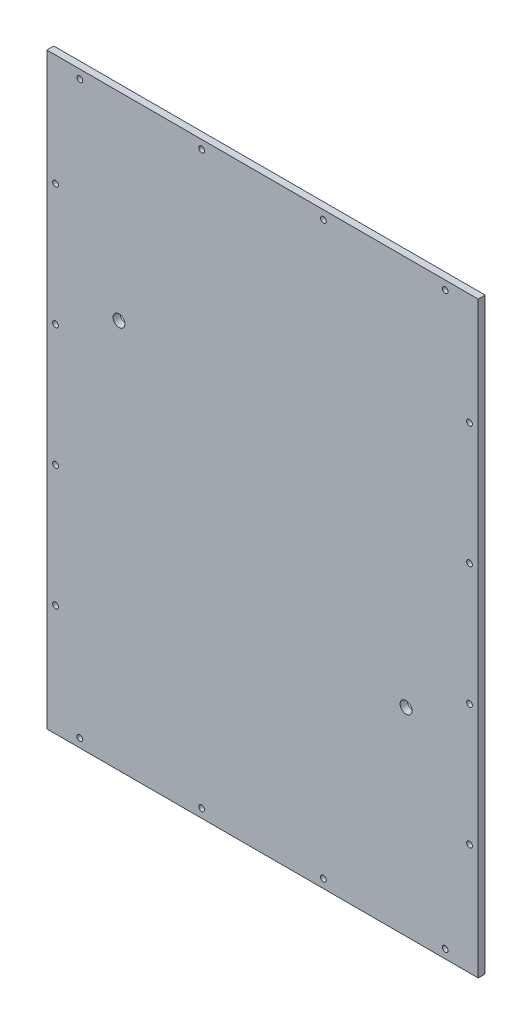
ISO-10303-21;
HEADER;
FILE_DESCRIPTION(('STEP AP214'),'2;1');
FILE_NAME('part.step','',(''),(''),'','','');
FILE_SCHEMA(('AUTOMOTIVE_DESIGN { 1 0 10303 214 1 1 1 1 }'));
ENDSEC;
DATA;
#1=APPLICATION_CONTEXT('core data for automotive mechanical design processes');
#2=APPLICATION_PROTOCOL_DEFINITION('international standard','automotive_design',2000,#1);
#3=PRODUCT_CONTEXT('',#1,'mechanical');
#4=PRODUCT('Part','Part','',(#3));
#5=PRODUCT_RELATED_PRODUCT_CATEGORY('part','',(#4));
#6=PRODUCT_DEFINITION_FORMATION('','',#4);
#7=PRODUCT_DEFINITION_CONTEXT('part definition',#1,'design');
#8=PRODUCT_DEFINITION('design','',#6,#7);
#9=PRODUCT_DEFINITION_SHAPE('','',#8);
#10=(LENGTH_UNIT() NAMED_UNIT(*) SI_UNIT(.MILLI.,.METRE.));
#11=(NAMED_UNIT(*) PLANE_ANGLE_UNIT() SI_UNIT($,.RADIAN.));
#12=(NAMED_UNIT(*) SI_UNIT($,.STERADIAN.) SOLID_ANGLE_UNIT());
#13=UNCERTAINTY_MEASURE_WITH_UNIT(LENGTH_MEASURE(1.E-05),#10,'distance_accuracy_value','');
#14=(GEOMETRIC_REPRESENTATION_CONTEXT(3) GLOBAL_UNCERTAINTY_ASSIGNED_CONTEXT((#13)) GLOBAL_UNIT_ASSIGNED_CONTEXT((#10,
#11,#12)) REPRESENTATION_CONTEXT('',''));
#15=CARTESIAN_POINT('',(0.,0.,0.));
#16=DIRECTION('',(0.,0.,1.));
#17=DIRECTION('',(1.,0.,0.));
#18=AXIS2_PLACEMENT_3D('',#15,#16,#17);
#19=CARTESIAN_POINT('',(124.,169.,4.));
#20=DIRECTION('',(1.,0.,0.));
#21=DIRECTION('',(0.,0.,-1.));
#22=AXIS2_PLACEMENT_3D('',#19,#20,#21);
#23=PLANE('',#22);
#24=DIRECTION('',(0.,-1.,0.));
#25=VECTOR('',#24,1.);
#26=CARTESIAN_POINT('',(124.,169.,0.));
#27=LINE('',#26,#25);
#28=CARTESIAN_POINT('',(124.,169.,0.));
#29=VERTEX_POINT('',#28);
#30=CARTESIAN_POINT('',(124.,-169.,0.));
#31=VERTEX_POINT('',#30);
#32=EDGE_CURVE('E112',#29,#31,#27,.T.);
#33=ORIENTED_EDGE('',*,*,#32,.F.);
#34=DIRECTION('',(0.,0.,-1.));
#35=VECTOR('',#34,1.);
#36=CARTESIAN_POINT('',(124.,169.,4.));
#37=LINE('',#36,#35);
#38=CARTESIAN_POINT('',(124.,169.,4.));
#39=VERTEX_POINT('',#38);
#40=EDGE_CURVE('E11',#39,#29,#37,.T.);
#41=ORIENTED_EDGE('',*,*,#40,.F.);
#42=DIRECTION('',(0.,-1.,0.));
#43=VECTOR('',#42,1.);
#44=CARTESIAN_POINT('',(124.,169.,4.));
#45=LINE('',#44,#43);
#46=CARTESIAN_POINT('',(124.,-169.,4.));
#47=VERTEX_POINT('',#46);
#48=EDGE_CURVE('E87',#39,#47,#45,.T.);
#49=ORIENTED_EDGE('',*,*,#48,.T.);
#50=DIRECTION('',(0.,0.,-1.));
#51=VECTOR('',#50,1.);
#52=CARTESIAN_POINT('',(124.,-169.,4.));
#53=LINE('',#52,#51);
#54=EDGE_CURVE('E92',#47,#31,#53,.T.);
#55=ORIENTED_EDGE('',*,*,#54,.T.);
#56=EDGE_LOOP('',(#33,#41,#49,#55));
#57=FACE_BOUND('',#56,.T.);
#58=ADVANCED_FACE('F42',(#57),#23,.T.);
#59=CARTESIAN_POINT('',(124.,169.,4.));
#60=DIRECTION('',(0.,1.,0.));
#61=DIRECTION('',(-1.,0.,0.));
#62=AXIS2_PLACEMENT_3D('',#59,#60,#61);
#63=PLANE('',#62);
#64=DIRECTION('',(1.,0.,0.));
#65=VECTOR('',#64,1.);
#66=CARTESIAN_POINT('',(124.,169.,0.));
#67=LINE('',#66,#65);
#68=CARTESIAN_POINT('',(-124.,169.,0.));
#69=VERTEX_POINT('',#68);
#70=EDGE_CURVE('E102',#69,#29,#67,.T.);
#71=ORIENTED_EDGE('',*,*,#70,.F.);
#72=DIRECTION('',(0.,0.,-1.));
#73=VECTOR('',#72,1.);
#74=CARTESIAN_POINT('',(-124.,169.,4.));
#75=LINE('',#74,#73);
#76=CARTESIAN_POINT('',(-124.,169.,4.));
#77=VERTEX_POINT('',#76);
#78=EDGE_CURVE('E51',#77,#69,#75,.T.);
#79=ORIENTED_EDGE('',*,*,#78,.F.);
#80=DIRECTION('',(1.,0.,0.));
#81=VECTOR('',#80,1.);
#82=CARTESIAN_POINT('',(124.,169.,4.));
#83=LINE('',#82,#81);
#84=EDGE_CURVE('E100',#77,#39,#83,.T.);
#85=ORIENTED_EDGE('',*,*,#84,.T.);
#86=ORIENTED_EDGE('',*,*,#40,.T.);
#87=EDGE_LOOP('',(#71,#79,#85,#86));
#88=FACE_BOUND('',#87,.T.);
#89=ADVANCED_FACE('F121',(#88),#63,.T.);
#90=CARTESIAN_POINT('',(-124.,169.,4.));
#91=DIRECTION('',(-1.,0.,0.));
#92=DIRECTION('',(0.,-1.,0.));
#93=AXIS2_PLACEMENT_3D('',#90,#91,#92);
#94=PLANE('',#93);
#95=DIRECTION('',(0.,1.,0.));
#96=VECTOR('',#95,1.);
#97=CARTESIAN_POINT('',(-124.,169.,0.));
#98=LINE('',#97,#96);
#99=CARTESIAN_POINT('',(-124.,-169.,0.));
#100=VERTEX_POINT('',#99);
#101=EDGE_CURVE('E59',#100,#69,#98,.T.);
#102=ORIENTED_EDGE('',*,*,#101,.F.);
#103=DIRECTION('',(0.,0.,-1.));
#104=VECTOR('',#103,1.);
#105=CARTESIAN_POINT('',(-124.,-169.,4.));
#106=LINE('',#105,#104);
#107=CARTESIAN_POINT('',(-124.,-169.,4.));
#108=VERTEX_POINT('',#107);
#109=EDGE_CURVE('E99',#108,#100,#106,.T.);
#110=ORIENTED_EDGE('',*,*,#109,.F.);
#111=DIRECTION('',(0.,1.,0.));
#112=VECTOR('',#111,1.);
#113=CARTESIAN_POINT('',(-124.,169.,4.));
#114=LINE('',#113,#112);
#115=EDGE_CURVE('E67',#108,#77,#114,.T.);
#116=ORIENTED_EDGE('',*,*,#115,.T.);
#117=ORIENTED_EDGE('',*,*,#78,.T.);
#118=EDGE_LOOP('',(#102,#110,#116,#117));
#119=FACE_BOUND('',#118,.T.);
#120=ADVANCED_FACE('F122',(#119),#94,.T.);
#121=CARTESIAN_POINT('',(124.,-169.,4.));
#122=DIRECTION('',(0.,-1.,0.));
#123=DIRECTION('',(1.,0.,0.));
#124=AXIS2_PLACEMENT_3D('',#121,#122,#123);
#125=PLANE('',#124);
#126=DIRECTION('',(-1.,0.,0.));
#127=VECTOR('',#126,1.);
#128=CARTESIAN_POINT('',(124.,-169.,0.));
#129=LINE('',#128,#127);
#130=EDGE_CURVE('E95',#31,#100,#129,.T.);
#131=ORIENTED_EDGE('',*,*,#130,.F.);
#132=ORIENTED_EDGE('',*,*,#54,.F.);
#133=DIRECTION('',(-1.,0.,0.));
#134=VECTOR('',#133,1.);
#135=CARTESIAN_POINT('',(124.,-169.,4.));
#136=LINE('',#135,#134);
#137=EDGE_CURVE('E82',#47,#108,#136,.T.);
#138=ORIENTED_EDGE('',*,*,#137,.T.);
#139=ORIENTED_EDGE('',*,*,#109,.T.);
#140=EDGE_LOOP('',(#131,#132,#138,#139));
#141=FACE_BOUND('',#140,.T.);
#142=ADVANCED_FACE('F93',(#141),#125,.T.);
#143=CARTESIAN_POINT('',(0.,0.,0.));
#144=DIRECTION('',(0.,0.,-1.));
#145=DIRECTION('',(-1.,0.,0.));
#146=AXIS2_PLACEMENT_3D('',#143,#144,#145);
#147=PLANE('',#146);
#148=CARTESIAN_POINT('',(-82.5,55.,0.));
#149=DIRECTION('',(0.,0.,-1.));
#150=DIRECTION('',(-1.,0.,0.));
#151=AXIS2_PLACEMENT_3D('',#148,#149,#150);
#152=CIRCLE('',#151,3.39999999999999);
#153=CARTESIAN_POINT('',(-85.9,55.,0.));
#154=VERTEX_POINT('',#153);
#155=EDGE_CURVE('E359',#154,#154,#152,.T.);
#156=ORIENTED_EDGE('',*,*,#155,.F.);
#157=EDGE_LOOP('',(#156));
#158=FACE_BOUND('',#157,.T.);
#159=CARTESIAN_POINT('',(82.5,-55.,0.));
#160=DIRECTION('',(0.,0.,-1.));
#161=DIRECTION('',(-1.,0.,0.));
#162=AXIS2_PLACEMENT_3D('',#159,#160,#161);
#163=CIRCLE('',#162,3.39999999999999);
#164=CARTESIAN_POINT('',(79.1,-55.,0.));
#165=VERTEX_POINT('',#164);
#166=EDGE_CURVE('E361',#165,#165,#163,.T.);
#167=ORIENTED_EDGE('',*,*,#166,.F.);
#168=EDGE_LOOP('',(#167));
#169=FACE_BOUND('',#168,.T.);
#170=CARTESIAN_POINT('',(-105.,-164.,0.));
#171=DIRECTION('',(0.,0.,-1.));
#172=DIRECTION('',(-1.,0.,0.));
#173=AXIS2_PLACEMENT_3D('',#170,#171,#172);
#174=CIRCLE('',#173,1.65);
#175=CARTESIAN_POINT('',(-106.65,-164.,0.));
#176=VERTEX_POINT('',#175);
#177=EDGE_CURVE('E414',#176,#176,#174,.T.);
#178=ORIENTED_EDGE('',*,*,#177,.F.);
#179=EDGE_LOOP('',(#178));
#180=FACE_BOUND('',#179,.T.);
#181=CARTESIAN_POINT('',(-35.,-164.,0.));
#182=DIRECTION('',(0.,0.,-1.));
#183=DIRECTION('',(-1.,0.,0.));
#184=AXIS2_PLACEMENT_3D('',#181,#182,#183);
#185=CIRCLE('',#184,1.65);
#186=CARTESIAN_POINT('',(-36.65,-164.,0.));
#187=VERTEX_POINT('',#186);
#188=EDGE_CURVE('E417',#187,#187,#185,.T.);
#189=ORIENTED_EDGE('',*,*,#188,.F.);
#190=EDGE_LOOP('',(#189));
#191=FACE_BOUND('',#190,.T.);
#192=CARTESIAN_POINT('',(-119.,-105.,0.));
#193=DIRECTION('',(0.,0.,-1.));
#194=DIRECTION('',(-1.,0.,0.));
#195=AXIS2_PLACEMENT_3D('',#192,#193,#194);
#196=CIRCLE('',#195,1.65);
#197=CARTESIAN_POINT('',(-120.65,-105.,0.));
#198=VERTEX_POINT('',#197);
#199=EDGE_CURVE('E420',#198,#198,#196,.T.);
#200=ORIENTED_EDGE('',*,*,#199,.F.);
#201=EDGE_LOOP('',(#200));
#202=FACE_BOUND('',#201,.T.);
#203=CARTESIAN_POINT('',(-119.,-35.,0.));
#204=DIRECTION('',(0.,0.,-1.));
#205=DIRECTION('',(-1.,0.,0.));
#206=AXIS2_PLACEMENT_3D('',#203,#204,#205);
#207=CIRCLE('',#206,1.65);
#208=CARTESIAN_POINT('',(-120.65,-35.,0.));
#209=VERTEX_POINT('',#208);
#210=EDGE_CURVE('E423',#209,#209,#207,.T.);
#211=ORIENTED_EDGE('',*,*,#210,.F.);
#212=EDGE_LOOP('',(#211));
#213=FACE_BOUND('',#212,.T.);
#214=CARTESIAN_POINT('',(-105.,164.,0.));
#215=DIRECTION('',(0.,0.,-1.));
#216=DIRECTION('',(-1.,0.,0.));
#217=AXIS2_PLACEMENT_3D('',#214,#215,#216);
#218=CIRCLE('',#217,1.65);
#219=CARTESIAN_POINT('',(-106.65,164.,0.));
#220=VERTEX_POINT('',#219);
#221=EDGE_CURVE('E426',#220,#220,#218,.T.);
#222=ORIENTED_EDGE('',*,*,#221,.F.);
#223=EDGE_LOOP('',(#222));
#224=FACE_BOUND('',#223,.T.);
#225=CARTESIAN_POINT('',(-35.,164.,0.));
#226=DIRECTION('',(0.,0.,-1.));
#227=DIRECTION('',(-1.,0.,0.));
#228=AXIS2_PLACEMENT_3D('',#225,#226,#227);
#229=CIRCLE('',#228,1.65);
#230=CARTESIAN_POINT('',(-36.65,164.,0.));
#231=VERTEX_POINT('',#230);
#232=EDGE_CURVE('E429',#231,#231,#229,.T.);
#233=ORIENTED_EDGE('',*,*,#232,.F.);
#234=EDGE_LOOP('',(#233));
#235=FACE_BOUND('',#234,.T.);
#236=CARTESIAN_POINT('',(-119.,105.,0.));
#237=DIRECTION('',(0.,0.,-1.));
#238=DIRECTION('',(-1.,0.,0.));
#239=AXIS2_PLACEMENT_3D('',#236,#237,#238);
#240=CIRCLE('',#239,1.65);
#241=CARTESIAN_POINT('',(-120.65,105.,0.));
#242=VERTEX_POINT('',#241);
#243=EDGE_CURVE('E432',#242,#242,#240,.T.);
#244=ORIENTED_EDGE('',*,*,#243,.F.);
#245=EDGE_LOOP('',(#244));
#246=FACE_BOUND('',#245,.T.);
#247=CARTESIAN_POINT('',(-119.,35.,0.));
#248=DIRECTION('',(0.,0.,-1.));
#249=DIRECTION('',(-1.,0.,0.));
#250=AXIS2_PLACEMENT_3D('',#247,#248,#249);
#251=CIRCLE('',#250,1.65);
#252=CARTESIAN_POINT('',(-120.65,35.,0.));
#253=VERTEX_POINT('',#252);
#254=EDGE_CURVE('E435',#253,#253,#251,.T.);
#255=ORIENTED_EDGE('',*,*,#254,.F.);
#256=EDGE_LOOP('',(#255));
#257=FACE_BOUND('',#256,.T.);
#258=CARTESIAN_POINT('',(105.,-164.,0.));
#259=DIRECTION('',(0.,0.,-1.));
#260=DIRECTION('',(-1.,0.,0.));
#261=AXIS2_PLACEMENT_3D('',#258,#259,#260);
#262=CIRCLE('',#261,1.65);
#263=CARTESIAN_POINT('',(103.35,-164.,0.));
#264=VERTEX_POINT('',#263);
#265=EDGE_CURVE('E438',#264,#264,#262,.T.);
#266=ORIENTED_EDGE('',*,*,#265,.F.);
#267=EDGE_LOOP('',(#266));
#268=FACE_BOUND('',#267,.T.);
#269=CARTESIAN_POINT('',(35.,-164.,0.));
#270=DIRECTION('',(0.,0.,-1.));
#271=DIRECTION('',(-1.,0.,0.));
#272=AXIS2_PLACEMENT_3D('',#269,#270,#271);
#273=CIRCLE('',#272,1.65);
#274=CARTESIAN_POINT('',(33.35,-164.,0.));
#275=VERTEX_POINT('',#274);
#276=EDGE_CURVE('E441',#275,#275,#273,.T.);
#277=ORIENTED_EDGE('',*,*,#276,.F.);
#278=EDGE_LOOP('',(#277));
#279=FACE_BOUND('',#278,.T.);
#280=CARTESIAN_POINT('',(119.,-105.,0.));
#281=DIRECTION('',(0.,0.,-1.));
#282=DIRECTION('',(-1.,0.,0.));
#283=AXIS2_PLACEMENT_3D('',#280,#281,#282);
#284=CIRCLE('',#283,1.65);
#285=CARTESIAN_POINT('',(117.35,-105.,0.));
#286=VERTEX_POINT('',#285);
#287=EDGE_CURVE('E444',#286,#286,#284,.T.);
#288=ORIENTED_EDGE('',*,*,#287,.F.);
#289=EDGE_LOOP('',(#288));
#290=FACE_BOUND('',#289,.T.);
#291=CARTESIAN_POINT('',(119.,-35.,0.));
#292=DIRECTION('',(0.,0.,-1.));
#293=DIRECTION('',(-1.,0.,0.));
#294=AXIS2_PLACEMENT_3D('',#291,#292,#293);
#295=CIRCLE('',#294,1.65);
#296=CARTESIAN_POINT('',(117.35,-35.,0.));
#297=VERTEX_POINT('',#296);
#298=EDGE_CURVE('E447',#297,#297,#295,.T.);
#299=ORIENTED_EDGE('',*,*,#298,.F.);
#300=EDGE_LOOP('',(#299));
#301=FACE_BOUND('',#300,.T.);
#302=CARTESIAN_POINT('',(105.,164.,0.));
#303=DIRECTION('',(0.,0.,-1.));
#304=DIRECTION('',(-1.,0.,0.));
#305=AXIS2_PLACEMENT_3D('',#302,#303,#304);
#306=CIRCLE('',#305,1.65);
#307=CARTESIAN_POINT('',(103.35,164.,0.));
#308=VERTEX_POINT('',#307);
#309=EDGE_CURVE('E450',#308,#308,#306,.T.);
#310=ORIENTED_EDGE('',*,*,#309,.F.);
#311=EDGE_LOOP('',(#310));
#312=FACE_BOUND('',#311,.T.);
#313=CARTESIAN_POINT('',(35.,164.,0.));
#314=DIRECTION('',(0.,0.,-1.));
#315=DIRECTION('',(-1.,0.,0.));
#316=AXIS2_PLACEMENT_3D('',#313,#314,#315);
#317=CIRCLE('',#316,1.65);
#318=CARTESIAN_POINT('',(33.35,164.,0.));
#319=VERTEX_POINT('',#318);
#320=EDGE_CURVE('E453',#319,#319,#317,.T.);
#321=ORIENTED_EDGE('',*,*,#320,.F.);
#322=EDGE_LOOP('',(#321));
#323=FACE_BOUND('',#322,.T.);
#324=CARTESIAN_POINT('',(119.,105.,0.));
#325=DIRECTION('',(0.,0.,-1.));
#326=DIRECTION('',(-1.,0.,0.));
#327=AXIS2_PLACEMENT_3D('',#324,#325,#326);
#328=CIRCLE('',#327,1.65);
#329=CARTESIAN_POINT('',(117.35,105.,0.));
#330=VERTEX_POINT('',#329);
#331=EDGE_CURVE('E455',#330,#330,#328,.T.);
#332=ORIENTED_EDGE('',*,*,#331,.F.);
#333=EDGE_LOOP('',(#332));
#334=FACE_BOUND('',#333,.T.);
#335=CARTESIAN_POINT('',(119.,35.,0.));
#336=DIRECTION('',(0.,0.,-1.));
#337=DIRECTION('',(-1.,0.,0.));
#338=AXIS2_PLACEMENT_3D('',#335,#336,#337);
#339=CIRCLE('',#338,1.65);
#340=CARTESIAN_POINT('',(117.35,35.,0.));
#341=VERTEX_POINT('',#340);
#342=EDGE_CURVE('E107',#341,#341,#339,.T.);
#343=ORIENTED_EDGE('',*,*,#342,.F.);
#344=EDGE_LOOP('',(#343));
#345=FACE_BOUND('',#344,.T.);
#346=ORIENTED_EDGE('',*,*,#70,.T.);
#347=ORIENTED_EDGE('',*,*,#32,.T.);
#348=ORIENTED_EDGE('',*,*,#130,.T.);
#349=ORIENTED_EDGE('',*,*,#101,.T.);
#350=EDGE_LOOP('',(#346,#347,#348,#349));
#351=FACE_BOUND('',#350,.T.);
#352=ADVANCED_FACE('F44',(#158,#169,#180,#191,#202,#213,#224,#235,#246,#257,#268,#279,#290,#301,
#312,#323,#334,#345,#351),#147,.T.);
#353=CARTESIAN_POINT('',(119.,35.,0.));
#354=DIRECTION('',(0.,0.,-1.));
#355=DIRECTION('',(-1.,0.,0.));
#356=AXIS2_PLACEMENT_3D('',#353,#354,#355);
#357=CYLINDRICAL_SURFACE('',#356,1.65);
#358=CARTESIAN_POINT('',(119.,35.,4.));
#359=DIRECTION('',(0.,0.,-1.));
#360=DIRECTION('',(-1.,0.,0.));
#361=AXIS2_PLACEMENT_3D('',#358,#359,#360);
#362=CIRCLE('',#361,1.65);
#363=CARTESIAN_POINT('',(117.35,35.,4.));
#364=VERTEX_POINT('',#363);
#365=EDGE_CURVE('E411',#364,#364,#362,.F.);
#366=ORIENTED_EDGE('',*,*,#365,.T.);
#367=EDGE_LOOP('',(#366));
#368=FACE_BOUND('',#367,.T.);
#369=ORIENTED_EDGE('',*,*,#342,.T.);
#370=EDGE_LOOP('',(#369));
#371=FACE_BOUND('',#370,.T.);
#372=ADVANCED_FACE('F155',(#368,#371),#357,.F.);
#373=CARTESIAN_POINT('',(119.,105.,0.));
#374=DIRECTION('',(0.,0.,-1.));
#375=DIRECTION('',(-1.,0.,0.));
#376=AXIS2_PLACEMENT_3D('',#373,#374,#375);
#377=CYLINDRICAL_SURFACE('',#376,1.65);
#378=CARTESIAN_POINT('',(119.,105.,4.));
#379=DIRECTION('',(0.,0.,-1.));
#380=DIRECTION('',(-1.,0.,0.));
#381=AXIS2_PLACEMENT_3D('',#378,#379,#380);
#382=CIRCLE('',#381,1.65);
#383=CARTESIAN_POINT('',(117.35,105.,4.));
#384=VERTEX_POINT('',#383);
#385=EDGE_CURVE('E408',#384,#384,#382,.F.);
#386=ORIENTED_EDGE('',*,*,#385,.T.);
#387=EDGE_LOOP('',(#386));
#388=FACE_BOUND('',#387,.T.);
#389=ORIENTED_EDGE('',*,*,#331,.T.);
#390=EDGE_LOOP('',(#389));
#391=FACE_BOUND('',#390,.T.);
#392=ADVANCED_FACE('F160',(#388,#391),#377,.F.);
#393=CARTESIAN_POINT('',(35.,164.,0.));
#394=DIRECTION('',(0.,0.,-1.));
#395=DIRECTION('',(-1.,0.,0.));
#396=AXIS2_PLACEMENT_3D('',#393,#394,#395);
#397=CYLINDRICAL_SURFACE('',#396,1.65);
#398=CARTESIAN_POINT('',(35.,164.,4.));
#399=DIRECTION('',(0.,0.,-1.));
#400=DIRECTION('',(-1.,0.,0.));
#401=AXIS2_PLACEMENT_3D('',#398,#399,#400);
#402=CIRCLE('',#401,1.65);
#403=CARTESIAN_POINT('',(33.35,164.,4.));
#404=VERTEX_POINT('',#403);
#405=EDGE_CURVE('E405',#404,#404,#402,.F.);
#406=ORIENTED_EDGE('',*,*,#405,.T.);
#407=EDGE_LOOP('',(#406));
#408=FACE_BOUND('',#407,.T.);
#409=ORIENTED_EDGE('',*,*,#320,.T.);
#410=EDGE_LOOP('',(#409));
#411=FACE_BOUND('',#410,.T.);
#412=ADVANCED_FACE('F170',(#408,#411),#397,.F.);
#413=CARTESIAN_POINT('',(105.,164.,0.));
#414=DIRECTION('',(0.,0.,-1.));
#415=DIRECTION('',(-1.,0.,0.));
#416=AXIS2_PLACEMENT_3D('',#413,#414,#415);
#417=CYLINDRICAL_SURFACE('',#416,1.65);
#418=CARTESIAN_POINT('',(105.,164.,4.));
#419=DIRECTION('',(0.,0.,-1.));
#420=DIRECTION('',(-1.,0.,0.));
#421=AXIS2_PLACEMENT_3D('',#418,#419,#420);
#422=CIRCLE('',#421,1.65);
#423=CARTESIAN_POINT('',(103.35,164.,4.));
#424=VERTEX_POINT('',#423);
#425=EDGE_CURVE('E402',#424,#424,#422,.F.);
#426=ORIENTED_EDGE('',*,*,#425,.T.);
#427=EDGE_LOOP('',(#426));
#428=FACE_BOUND('',#427,.T.);
#429=ORIENTED_EDGE('',*,*,#309,.T.);
#430=EDGE_LOOP('',(#429));
#431=FACE_BOUND('',#430,.T.);
#432=ADVANCED_FACE('F180',(#428,#431),#417,.F.);
#433=CARTESIAN_POINT('',(119.,-35.,0.));
#434=DIRECTION('',(0.,0.,-1.));
#435=DIRECTION('',(-1.,0.,0.));
#436=AXIS2_PLACEMENT_3D('',#433,#434,#435);
#437=CYLINDRICAL_SURFACE('',#436,1.65);
#438=CARTESIAN_POINT('',(119.,-35.,4.));
#439=DIRECTION('',(0.,0.,-1.));
#440=DIRECTION('',(-1.,0.,0.));
#441=AXIS2_PLACEMENT_3D('',#438,#439,#440);
#442=CIRCLE('',#441,1.65);
#443=CARTESIAN_POINT('',(117.35,-35.,4.));
#444=VERTEX_POINT('',#443);
#445=EDGE_CURVE('E399',#444,#444,#442,.F.);
#446=ORIENTED_EDGE('',*,*,#445,.T.);
#447=EDGE_LOOP('',(#446));
#448=FACE_BOUND('',#447,.T.);
#449=ORIENTED_EDGE('',*,*,#298,.T.);
#450=EDGE_LOOP('',(#449));
#451=FACE_BOUND('',#450,.T.);
#452=ADVANCED_FACE('F190',(#448,#451),#437,.F.);
#453=CARTESIAN_POINT('',(119.,-105.,0.));
#454=DIRECTION('',(0.,0.,-1.));
#455=DIRECTION('',(-1.,0.,0.));
#456=AXIS2_PLACEMENT_3D('',#453,#454,#455);
#457=CYLINDRICAL_SURFACE('',#456,1.65);
#458=CARTESIAN_POINT('',(119.,-105.,4.));
#459=DIRECTION('',(0.,0.,-1.));
#460=DIRECTION('',(-1.,0.,0.));
#461=AXIS2_PLACEMENT_3D('',#458,#459,#460);
#462=CIRCLE('',#461,1.65);
#463=CARTESIAN_POINT('',(117.35,-105.,4.));
#464=VERTEX_POINT('',#463);
#465=EDGE_CURVE('E396',#464,#464,#462,.F.);
#466=ORIENTED_EDGE('',*,*,#465,.T.);
#467=EDGE_LOOP('',(#466));
#468=FACE_BOUND('',#467,.T.);
#469=ORIENTED_EDGE('',*,*,#287,.T.);
#470=EDGE_LOOP('',(#469));
#471=FACE_BOUND('',#470,.T.);
#472=ADVANCED_FACE('F200',(#468,#471),#457,.F.);
#473=CARTESIAN_POINT('',(35.,-164.,0.));
#474=DIRECTION('',(0.,0.,-1.));
#475=DIRECTION('',(-1.,0.,0.));
#476=AXIS2_PLACEMENT_3D('',#473,#474,#475);
#477=CYLINDRICAL_SURFACE('',#476,1.65);
#478=CARTESIAN_POINT('',(35.,-164.,4.));
#479=DIRECTION('',(0.,0.,-1.));
#480=DIRECTION('',(-1.,0.,0.));
#481=AXIS2_PLACEMENT_3D('',#478,#479,#480);
#482=CIRCLE('',#481,1.65);
#483=CARTESIAN_POINT('',(33.35,-164.,4.));
#484=VERTEX_POINT('',#483);
#485=EDGE_CURVE('E393',#484,#484,#482,.F.);
#486=ORIENTED_EDGE('',*,*,#485,.T.);
#487=EDGE_LOOP('',(#486));
#488=FACE_BOUND('',#487,.T.);
#489=ORIENTED_EDGE('',*,*,#276,.T.);
#490=EDGE_LOOP('',(#489));
#491=FACE_BOUND('',#490,.T.);
#492=ADVANCED_FACE('F211',(#488,#491),#477,.F.);
#493=CARTESIAN_POINT('',(105.,-164.,0.));
#494=DIRECTION('',(0.,0.,-1.));
#495=DIRECTION('',(-1.,0.,0.));
#496=AXIS2_PLACEMENT_3D('',#493,#494,#495);
#497=CYLINDRICAL_SURFACE('',#496,1.65);
#498=CARTESIAN_POINT('',(105.,-164.,4.));
#499=DIRECTION('',(0.,0.,-1.));
#500=DIRECTION('',(-1.,0.,0.));
#501=AXIS2_PLACEMENT_3D('',#498,#499,#500);
#502=CIRCLE('',#501,1.65);
#503=CARTESIAN_POINT('',(103.35,-164.,4.));
#504=VERTEX_POINT('',#503);
#505=EDGE_CURVE('E390',#504,#504,#502,.F.);
#506=ORIENTED_EDGE('',*,*,#505,.T.);
#507=EDGE_LOOP('',(#506));
#508=FACE_BOUND('',#507,.T.);
#509=ORIENTED_EDGE('',*,*,#265,.T.);
#510=EDGE_LOOP('',(#509));
#511=FACE_BOUND('',#510,.T.);
#512=ADVANCED_FACE('F221',(#508,#511),#497,.F.);
#513=CARTESIAN_POINT('',(-119.,35.,0.));
#514=DIRECTION('',(0.,0.,-1.));
#515=DIRECTION('',(-1.,0.,0.));
#516=AXIS2_PLACEMENT_3D('',#513,#514,#515);
#517=CYLINDRICAL_SURFACE('',#516,1.65);
#518=CARTESIAN_POINT('',(-119.,35.,4.));
#519=DIRECTION('',(0.,0.,-1.));
#520=DIRECTION('',(-1.,0.,0.));
#521=AXIS2_PLACEMENT_3D('',#518,#519,#520);
#522=CIRCLE('',#521,1.65);
#523=CARTESIAN_POINT('',(-120.65,35.,4.));
#524=VERTEX_POINT('',#523);
#525=EDGE_CURVE('E387',#524,#524,#522,.F.);
#526=ORIENTED_EDGE('',*,*,#525,.T.);
#527=EDGE_LOOP('',(#526));
#528=FACE_BOUND('',#527,.T.);
#529=ORIENTED_EDGE('',*,*,#254,.T.);
#530=EDGE_LOOP('',(#529));
#531=FACE_BOUND('',#530,.T.);
#532=ADVANCED_FACE('F230',(#528,#531),#517,.F.);
#533=CARTESIAN_POINT('',(-119.,105.,0.));
#534=DIRECTION('',(0.,0.,-1.));
#535=DIRECTION('',(-1.,0.,0.));
#536=AXIS2_PLACEMENT_3D('',#533,#534,#535);
#537=CYLINDRICAL_SURFACE('',#536,1.65);
#538=CARTESIAN_POINT('',(-119.,105.,4.));
#539=DIRECTION('',(0.,0.,-1.));
#540=DIRECTION('',(-1.,0.,0.));
#541=AXIS2_PLACEMENT_3D('',#538,#539,#540);
#542=CIRCLE('',#541,1.65);
#543=CARTESIAN_POINT('',(-120.65,105.,4.));
#544=VERTEX_POINT('',#543);
#545=EDGE_CURVE('E384',#544,#544,#542,.F.);
#546=ORIENTED_EDGE('',*,*,#545,.T.);
#547=EDGE_LOOP('',(#546));
#548=FACE_BOUND('',#547,.T.);
#549=ORIENTED_EDGE('',*,*,#243,.T.);
#550=EDGE_LOOP('',(#549));
#551=FACE_BOUND('',#550,.T.);
#552=ADVANCED_FACE('F240',(#548,#551),#537,.F.);
#553=CARTESIAN_POINT('',(-35.,164.,0.));
#554=DIRECTION('',(0.,0.,-1.));
#555=DIRECTION('',(-1.,0.,0.));
#556=AXIS2_PLACEMENT_3D('',#553,#554,#555);
#557=CYLINDRICAL_SURFACE('',#556,1.65);
#558=CARTESIAN_POINT('',(-35.,164.,4.));
#559=DIRECTION('',(0.,0.,-1.));
#560=DIRECTION('',(-1.,0.,0.));
#561=AXIS2_PLACEMENT_3D('',#558,#559,#560);
#562=CIRCLE('',#561,1.65);
#563=CARTESIAN_POINT('',(-36.65,164.,4.));
#564=VERTEX_POINT('',#563);
#565=EDGE_CURVE('E381',#564,#564,#562,.F.);
#566=ORIENTED_EDGE('',*,*,#565,.T.);
#567=EDGE_LOOP('',(#566));
#568=FACE_BOUND('',#567,.T.);
#569=ORIENTED_EDGE('',*,*,#232,.T.);
#570=EDGE_LOOP('',(#569));
#571=FACE_BOUND('',#570,.T.);
#572=ADVANCED_FACE('F252',(#568,#571),#557,.F.);
#573=CARTESIAN_POINT('',(-105.,164.,0.));
#574=DIRECTION('',(0.,0.,-1.));
#575=DIRECTION('',(-1.,0.,0.));
#576=AXIS2_PLACEMENT_3D('',#573,#574,#575);
#577=CYLINDRICAL_SURFACE('',#576,1.65);
#578=CARTESIAN_POINT('',(-105.,164.,4.));
#579=DIRECTION('',(0.,0.,-1.));
#580=DIRECTION('',(-1.,0.,0.));
#581=AXIS2_PLACEMENT_3D('',#578,#579,#580);
#582=CIRCLE('',#581,1.65);
#583=CARTESIAN_POINT('',(-106.65,164.,4.));
#584=VERTEX_POINT('',#583);
#585=EDGE_CURVE('E378',#584,#584,#582,.F.);
#586=ORIENTED_EDGE('',*,*,#585,.T.);
#587=EDGE_LOOP('',(#586));
#588=FACE_BOUND('',#587,.T.);
#589=ORIENTED_EDGE('',*,*,#221,.T.);
#590=EDGE_LOOP('',(#589));
#591=FACE_BOUND('',#590,.T.);
#592=ADVANCED_FACE('F263',(#588,#591),#577,.F.);
#593=CARTESIAN_POINT('',(-119.,-35.,0.));
#594=DIRECTION('',(0.,0.,-1.));
#595=DIRECTION('',(-1.,0.,0.));
#596=AXIS2_PLACEMENT_3D('',#593,#594,#595);
#597=CYLINDRICAL_SURFACE('',#596,1.65);
#598=CARTESIAN_POINT('',(-119.,-35.,4.));
#599=DIRECTION('',(0.,0.,-1.));
#600=DIRECTION('',(-1.,0.,0.));
#601=AXIS2_PLACEMENT_3D('',#598,#599,#600);
#602=CIRCLE('',#601,1.65);
#603=CARTESIAN_POINT('',(-120.65,-35.,4.));
#604=VERTEX_POINT('',#603);
#605=EDGE_CURVE('E375',#604,#604,#602,.F.);
#606=ORIENTED_EDGE('',*,*,#605,.T.);
#607=EDGE_LOOP('',(#606));
#608=FACE_BOUND('',#607,.T.);
#609=ORIENTED_EDGE('',*,*,#210,.T.);
#610=EDGE_LOOP('',(#609));
#611=FACE_BOUND('',#610,.T.);
#612=ADVANCED_FACE('F274',(#608,#611),#597,.F.);
#613=CARTESIAN_POINT('',(-119.,-105.,0.));
#614=DIRECTION('',(0.,0.,-1.));
#615=DIRECTION('',(-1.,0.,0.));
#616=AXIS2_PLACEMENT_3D('',#613,#614,#615);
#617=CYLINDRICAL_SURFACE('',#616,1.65);
#618=CARTESIAN_POINT('',(-119.,-105.,4.));
#619=DIRECTION('',(0.,0.,-1.));
#620=DIRECTION('',(-1.,0.,0.));
#621=AXIS2_PLACEMENT_3D('',#618,#619,#620);
#622=CIRCLE('',#621,1.65);
#623=CARTESIAN_POINT('',(-120.65,-105.,4.));
#624=VERTEX_POINT('',#623);
#625=EDGE_CURVE('E372',#624,#624,#622,.F.);
#626=ORIENTED_EDGE('',*,*,#625,.T.);
#627=EDGE_LOOP('',(#626));
#628=FACE_BOUND('',#627,.T.);
#629=ORIENTED_EDGE('',*,*,#199,.T.);
#630=EDGE_LOOP('',(#629));
#631=FACE_BOUND('',#630,.T.);
#632=ADVANCED_FACE('F283',(#628,#631),#617,.F.);
#633=CARTESIAN_POINT('',(-35.,-164.,0.));
#634=DIRECTION('',(0.,0.,-1.));
#635=DIRECTION('',(-1.,0.,0.));
#636=AXIS2_PLACEMENT_3D('',#633,#634,#635);
#637=CYLINDRICAL_SURFACE('',#636,1.65);
#638=CARTESIAN_POINT('',(-35.,-164.,4.));
#639=DIRECTION('',(0.,0.,-1.));
#640=DIRECTION('',(-1.,0.,0.));
#641=AXIS2_PLACEMENT_3D('',#638,#639,#640);
#642=CIRCLE('',#641,1.65);
#643=CARTESIAN_POINT('',(-36.65,-164.,4.));
#644=VERTEX_POINT('',#643);
#645=EDGE_CURVE('E369',#644,#644,#642,.F.);
#646=ORIENTED_EDGE('',*,*,#645,.T.);
#647=EDGE_LOOP('',(#646));
#648=FACE_BOUND('',#647,.T.);
#649=ORIENTED_EDGE('',*,*,#188,.T.);
#650=EDGE_LOOP('',(#649));
#651=FACE_BOUND('',#650,.T.);
#652=ADVANCED_FACE('F292',(#648,#651),#637,.F.);
#653=CARTESIAN_POINT('',(-105.,-164.,0.));
#654=DIRECTION('',(0.,0.,-1.));
#655=DIRECTION('',(-1.,0.,0.));
#656=AXIS2_PLACEMENT_3D('',#653,#654,#655);
#657=CYLINDRICAL_SURFACE('',#656,1.65);
#658=CARTESIAN_POINT('',(-105.,-164.,4.));
#659=DIRECTION('',(0.,0.,-1.));
#660=DIRECTION('',(-1.,0.,0.));
#661=AXIS2_PLACEMENT_3D('',#658,#659,#660);
#662=CIRCLE('',#661,1.65);
#663=CARTESIAN_POINT('',(-106.65,-164.,4.));
#664=VERTEX_POINT('',#663);
#665=EDGE_CURVE('E46',#664,#664,#662,.F.);
#666=ORIENTED_EDGE('',*,*,#665,.T.);
#667=EDGE_LOOP('',(#666));
#668=FACE_BOUND('',#667,.T.);
#669=ORIENTED_EDGE('',*,*,#177,.T.);
#670=EDGE_LOOP('',(#669));
#671=FACE_BOUND('',#670,.T.);
#672=ADVANCED_FACE('F301',(#668,#671),#657,.F.);
#673=CARTESIAN_POINT('',(0.,0.,4.));
#674=DIRECTION('',(0.,0.,-1.));
#675=DIRECTION('',(-1.,0.,0.));
#676=AXIS2_PLACEMENT_3D('',#673,#674,#675);
#677=PLANE('',#676);
#678=CARTESIAN_POINT('',(-82.5,55.,4.));
#679=DIRECTION('',(0.,0.,-1.));
#680=DIRECTION('',(-1.,0.,0.));
#681=AXIS2_PLACEMENT_3D('',#678,#679,#680);
#682=CIRCLE('',#681,3.4);
#683=CARTESIAN_POINT('',(-85.9,55.,4.));
#684=VERTEX_POINT('',#683);
#685=EDGE_CURVE('E356',#684,#684,#682,.T.);
#686=ORIENTED_EDGE('',*,*,#685,.T.);
#687=EDGE_LOOP('',(#686));
#688=FACE_BOUND('',#687,.T.);
#689=CARTESIAN_POINT('',(82.5,-55.,4.));
#690=DIRECTION('',(0.,0.,-1.));
#691=DIRECTION('',(-1.,0.,0.));
#692=AXIS2_PLACEMENT_3D('',#689,#690,#691);
#693=CIRCLE('',#692,3.4);
#694=CARTESIAN_POINT('',(79.1,-55.,4.));
#695=VERTEX_POINT('',#694);
#696=EDGE_CURVE('E366',#695,#695,#693,.T.);
#697=ORIENTED_EDGE('',*,*,#696,.T.);
#698=EDGE_LOOP('',(#697));
#699=FACE_BOUND('',#698,.T.);
#700=ORIENTED_EDGE('',*,*,#48,.F.);
#701=ORIENTED_EDGE('',*,*,#84,.F.);
#702=ORIENTED_EDGE('',*,*,#115,.F.);
#703=ORIENTED_EDGE('',*,*,#137,.F.);
#704=EDGE_LOOP('',(#700,#701,#702,#703));
#705=FACE_BOUND('',#704,.T.);
#706=ORIENTED_EDGE('',*,*,#385,.F.);
#707=EDGE_LOOP('',(#706));
#708=FACE_BOUND('',#707,.T.);
#709=ORIENTED_EDGE('',*,*,#425,.F.);
#710=EDGE_LOOP('',(#709));
#711=FACE_BOUND('',#710,.T.);
#712=ORIENTED_EDGE('',*,*,#465,.F.);
#713=EDGE_LOOP('',(#712));
#714=FACE_BOUND('',#713,.T.);
#715=ORIENTED_EDGE('',*,*,#505,.F.);
#716=EDGE_LOOP('',(#715));
#717=FACE_BOUND('',#716,.T.);
#718=ORIENTED_EDGE('',*,*,#545,.F.);
#719=EDGE_LOOP('',(#718));
#720=FACE_BOUND('',#719,.T.);
#721=ORIENTED_EDGE('',*,*,#585,.F.);
#722=EDGE_LOOP('',(#721));
#723=FACE_BOUND('',#722,.T.);
#724=ORIENTED_EDGE('',*,*,#625,.F.);
#725=EDGE_LOOP('',(#724));
#726=FACE_BOUND('',#725,.T.);
#727=ORIENTED_EDGE('',*,*,#665,.F.);
#728=EDGE_LOOP('',(#727));
#729=FACE_BOUND('',#728,.T.);
#730=ORIENTED_EDGE('',*,*,#645,.F.);
#731=EDGE_LOOP('',(#730));
#732=FACE_BOUND('',#731,.T.);
#733=ORIENTED_EDGE('',*,*,#605,.F.);
#734=EDGE_LOOP('',(#733));
#735=FACE_BOUND('',#734,.T.);
#736=ORIENTED_EDGE('',*,*,#565,.F.);
#737=EDGE_LOOP('',(#736));
#738=FACE_BOUND('',#737,.T.);
#739=ORIENTED_EDGE('',*,*,#525,.F.);
#740=EDGE_LOOP('',(#739));
#741=FACE_BOUND('',#740,.T.);
#742=ORIENTED_EDGE('',*,*,#485,.F.);
#743=EDGE_LOOP('',(#742));
#744=FACE_BOUND('',#743,.T.);
#745=ORIENTED_EDGE('',*,*,#445,.F.);
#746=EDGE_LOOP('',(#745));
#747=FACE_BOUND('',#746,.T.);
#748=ORIENTED_EDGE('',*,*,#405,.F.);
#749=EDGE_LOOP('',(#748));
#750=FACE_BOUND('',#749,.T.);
#751=ORIENTED_EDGE('',*,*,#365,.F.);
#752=EDGE_LOOP('',(#751));
#753=FACE_BOUND('',#752,.T.);
#754=ADVANCED_FACE('F84',(#688,#699,#705,#708,#711,#714,#717,#720,#723,#726,#729,#732,#735,#738,
#741,#744,#747,#750,#753),#677,.F.);
#755=CARTESIAN_POINT('',(82.5,-55.,0.));
#756=DIRECTION('',(0.,0.,-1.));
#757=DIRECTION('',(-1.,0.,0.));
#758=AXIS2_PLACEMENT_3D('',#755,#756,#757);
#759=CYLINDRICAL_SURFACE('',#758,3.39999999999999);
#760=ORIENTED_EDGE('',*,*,#696,.F.);
#761=EDGE_LOOP('',(#760));
#762=FACE_BOUND('',#761,.T.);
#763=ORIENTED_EDGE('',*,*,#166,.T.);
#764=EDGE_LOOP('',(#763));
#765=FACE_BOUND('',#764,.T.);
#766=ADVANCED_FACE('F316',(#762,#765),#759,.F.);
#767=CARTESIAN_POINT('',(-82.5,55.,0.));
#768=DIRECTION('',(0.,0.,-1.));
#769=DIRECTION('',(-1.,0.,0.));
#770=AXIS2_PLACEMENT_3D('',#767,#768,#769);
#771=CYLINDRICAL_SURFACE('',#770,3.39999999999999);
#772=ORIENTED_EDGE('',*,*,#685,.F.);
#773=EDGE_LOOP('',(#772));
#774=FACE_BOUND('',#773,.T.);
#775=ORIENTED_EDGE('',*,*,#155,.T.);
#776=EDGE_LOOP('',(#775));
#777=FACE_BOUND('',#776,.T.);
#778=ADVANCED_FACE('F321',(#774,#777),#771,.F.);
#779=CLOSED_SHELL('',(#58,#89,#120,#142,#352,#372,#392,#412,#432,#452,#472,#492,#512,#532,#552,
#572,#592,#612,#632,#652,#672,#754,#766,#778));
#780=MANIFOLD_SOLID_BREP('B2',#779);
#781=ADVANCED_BREP_SHAPE_REPRESENTATION('',(#18,#780),#14);
#782=SHAPE_DEFINITION_REPRESENTATION(#9,#781);
ENDSEC;
END-ISO-10303-21;
